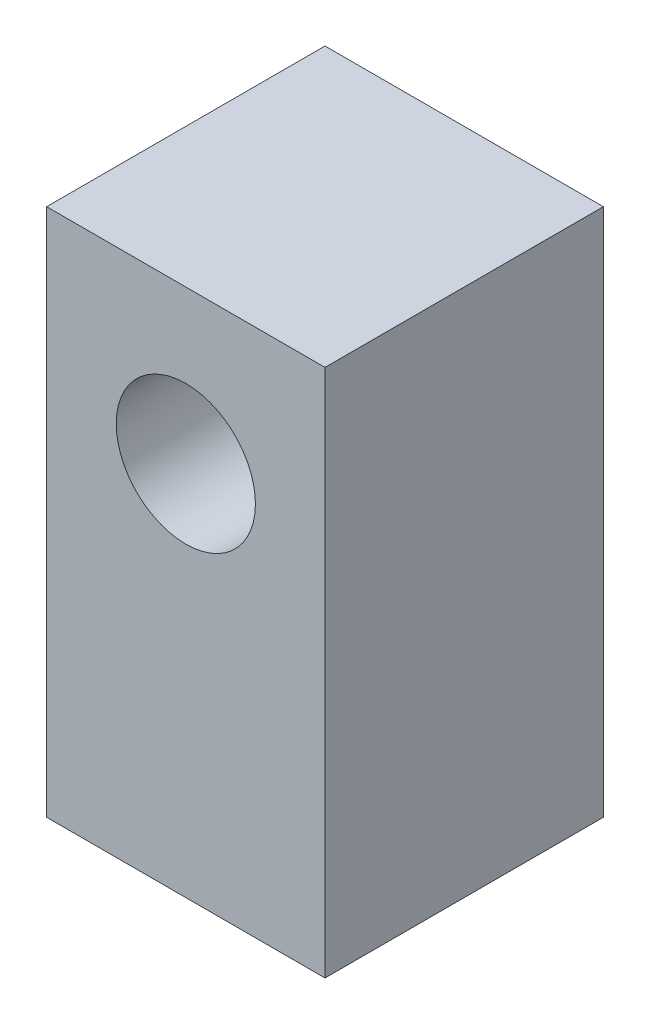
ISO-10303-21;
HEADER;
FILE_DESCRIPTION(('STEP AP214'),'2;1');
FILE_NAME('part.step','',(''),(''),'','','');
FILE_SCHEMA(('AUTOMOTIVE_DESIGN { 1 0 10303 214 1 1 1 1 }'));
ENDSEC;
DATA;
#1=APPLICATION_CONTEXT('core data for automotive mechanical design processes');
#2=APPLICATION_PROTOCOL_DEFINITION('international standard','automotive_design',2000,#1);
#3=PRODUCT_CONTEXT('',#1,'mechanical');
#4=PRODUCT('Part','Part','',(#3));
#5=PRODUCT_RELATED_PRODUCT_CATEGORY('part','',(#4));
#6=PRODUCT_DEFINITION_FORMATION('','',#4);
#7=PRODUCT_DEFINITION_CONTEXT('part definition',#1,'design');
#8=PRODUCT_DEFINITION('design','',#6,#7);
#9=PRODUCT_DEFINITION_SHAPE('','',#8);
#10=(LENGTH_UNIT() NAMED_UNIT(*) SI_UNIT(.MILLI.,.METRE.));
#11=(NAMED_UNIT(*) PLANE_ANGLE_UNIT() SI_UNIT($,.RADIAN.));
#12=(NAMED_UNIT(*) SI_UNIT($,.STERADIAN.) SOLID_ANGLE_UNIT());
#13=UNCERTAINTY_MEASURE_WITH_UNIT(LENGTH_MEASURE(1.E-05),#10,'distance_accuracy_value','');
#14=(GEOMETRIC_REPRESENTATION_CONTEXT(3) GLOBAL_UNCERTAINTY_ASSIGNED_CONTEXT((#13)) GLOBAL_UNIT_ASSIGNED_CONTEXT((#10,
#11,#12)) REPRESENTATION_CONTEXT('',''));
#15=CARTESIAN_POINT('',(0.,0.,0.));
#16=DIRECTION('',(0.,0.,1.));
#17=DIRECTION('',(1.,0.,0.));
#18=AXIS2_PLACEMENT_3D('',#15,#16,#17);
#19=CARTESIAN_POINT('',(0.,0.,10.));
#20=DIRECTION('',(1.,0.,0.));
#21=DIRECTION('',(0.,0.,-1.));
#22=AXIS2_PLACEMENT_3D('',#19,#20,#21);
#23=PLANE('',#22);
#24=DIRECTION('',(0.,-1.,0.));
#25=VECTOR('',#24,1.);
#26=CARTESIAN_POINT('',(0.,0.,0.));
#27=LINE('',#26,#25);
#28=CARTESIAN_POINT('',(0.,19.,0.));
#29=VERTEX_POINT('',#28);
#30=CARTESIAN_POINT('',(0.,0.,0.));
#31=VERTEX_POINT('',#30);
#32=EDGE_CURVE('E98',#29,#31,#27,.T.);
#33=ORIENTED_EDGE('',*,*,#32,.T.);
#34=DIRECTION('',(0.,0.,-1.));
#35=VECTOR('',#34,1.);
#36=CARTESIAN_POINT('',(0.,0.,10.));
#37=LINE('',#36,#35);
#38=CARTESIAN_POINT('',(0.,0.,10.));
#39=VERTEX_POINT('',#38);
#40=EDGE_CURVE('E11',#39,#31,#37,.T.);
#41=ORIENTED_EDGE('',*,*,#40,.F.);
#42=DIRECTION('',(0.,-1.,0.));
#43=VECTOR('',#42,1.);
#44=CARTESIAN_POINT('',(0.,0.,10.));
#45=LINE('',#44,#43);
#46=CARTESIAN_POINT('',(0.,19.,10.));
#47=VERTEX_POINT('',#46);
#48=EDGE_CURVE('E86',#47,#39,#45,.T.);
#49=ORIENTED_EDGE('',*,*,#48,.F.);
#50=DIRECTION('',(0.,0.,-1.));
#51=VECTOR('',#50,1.);
#52=CARTESIAN_POINT('',(0.,19.,10.));
#53=LINE('',#52,#51);
#54=EDGE_CURVE('E94',#47,#29,#53,.T.);
#55=ORIENTED_EDGE('',*,*,#54,.T.);
#56=EDGE_LOOP('',(#33,#41,#49,#55));
#57=FACE_BOUND('',#56,.T.);
#58=ADVANCED_FACE('F35',(#57),#23,.F.);
#59=CARTESIAN_POINT('',(0.,0.,10.));
#60=DIRECTION('',(0.,1.,0.));
#61=DIRECTION('',(0.,0.,1.));
#62=AXIS2_PLACEMENT_3D('',#59,#60,#61);
#63=PLANE('',#62);
#64=DIRECTION('',(1.,0.,0.));
#65=VECTOR('',#64,1.);
#66=CARTESIAN_POINT('',(0.,0.,0.));
#67=LINE('',#66,#65);
#68=CARTESIAN_POINT('',(10.,0.,0.));
#69=VERTEX_POINT('',#68);
#70=EDGE_CURVE('E90',#31,#69,#67,.T.);
#71=ORIENTED_EDGE('',*,*,#70,.T.);
#72=DIRECTION('',(0.,0.,-1.));
#73=VECTOR('',#72,1.);
#74=CARTESIAN_POINT('',(10.,0.,10.));
#75=LINE('',#74,#73);
#76=CARTESIAN_POINT('',(10.,0.,10.));
#77=VERTEX_POINT('',#76);
#78=EDGE_CURVE('E43',#77,#69,#75,.T.);
#79=ORIENTED_EDGE('',*,*,#78,.F.);
#80=DIRECTION('',(1.,0.,0.));
#81=VECTOR('',#80,1.);
#82=CARTESIAN_POINT('',(0.,0.,10.));
#83=LINE('',#82,#81);
#84=EDGE_CURVE('E81',#39,#77,#83,.T.);
#85=ORIENTED_EDGE('',*,*,#84,.F.);
#86=ORIENTED_EDGE('',*,*,#40,.T.);
#87=EDGE_LOOP('',(#71,#79,#85,#86));
#88=FACE_BOUND('',#87,.T.);
#89=ADVANCED_FACE('F89',(#88),#63,.F.);
#90=CARTESIAN_POINT('',(10.,0.,10.));
#91=DIRECTION('',(-1.,0.,0.));
#92=DIRECTION('',(0.,0.,1.));
#93=AXIS2_PLACEMENT_3D('',#90,#91,#92);
#94=PLANE('',#93);
#95=DIRECTION('',(0.,1.,0.));
#96=VECTOR('',#95,1.);
#97=CARTESIAN_POINT('',(10.,0.,0.));
#98=LINE('',#97,#96);
#99=CARTESIAN_POINT('',(10.,19.,0.));
#100=VERTEX_POINT('',#99);
#101=EDGE_CURVE('E68',#69,#100,#98,.T.);
#102=ORIENTED_EDGE('',*,*,#101,.T.);
#103=DIRECTION('',(0.,0.,-1.));
#104=VECTOR('',#103,1.);
#105=CARTESIAN_POINT('',(10.,19.,10.));
#106=LINE('',#105,#104);
#107=CARTESIAN_POINT('',(10.,19.,10.));
#108=VERTEX_POINT('',#107);
#109=EDGE_CURVE('E91',#108,#100,#106,.T.);
#110=ORIENTED_EDGE('',*,*,#109,.F.);
#111=DIRECTION('',(0.,1.,0.));
#112=VECTOR('',#111,1.);
#113=CARTESIAN_POINT('',(10.,0.,10.));
#114=LINE('',#113,#112);
#115=EDGE_CURVE('E84',#77,#108,#114,.T.);
#116=ORIENTED_EDGE('',*,*,#115,.F.);
#117=ORIENTED_EDGE('',*,*,#78,.T.);
#118=EDGE_LOOP('',(#102,#110,#116,#117));
#119=FACE_BOUND('',#118,.T.);
#120=ADVANCED_FACE('F92',(#119),#94,.F.);
#121=CARTESIAN_POINT('',(0.,19.,10.));
#122=DIRECTION('',(0.,-1.,0.));
#123=DIRECTION('',(0.,0.,-1.));
#124=AXIS2_PLACEMENT_3D('',#121,#122,#123);
#125=PLANE('',#124);
#126=DIRECTION('',(-1.,0.,0.));
#127=VECTOR('',#126,1.);
#128=CARTESIAN_POINT('',(0.,19.,0.));
#129=LINE('',#128,#127);
#130=EDGE_CURVE('E74',#100,#29,#129,.T.);
#131=ORIENTED_EDGE('',*,*,#130,.T.);
#132=ORIENTED_EDGE('',*,*,#54,.F.);
#133=DIRECTION('',(-1.,0.,0.));
#134=VECTOR('',#133,1.);
#135=CARTESIAN_POINT('',(0.,19.,10.));
#136=LINE('',#135,#134);
#137=EDGE_CURVE('E51',#108,#47,#136,.T.);
#138=ORIENTED_EDGE('',*,*,#137,.F.);
#139=ORIENTED_EDGE('',*,*,#109,.T.);
#140=EDGE_LOOP('',(#131,#132,#138,#139));
#141=FACE_BOUND('',#140,.T.);
#142=ADVANCED_FACE('F106',(#141),#125,.F.);
#143=CARTESIAN_POINT('',(0.,0.,10.));
#144=DIRECTION('',(0.,0.,-1.));
#145=DIRECTION('',(-1.,0.,0.));
#146=AXIS2_PLACEMENT_3D('',#143,#144,#145);
#147=PLANE('',#146);
#148=CARTESIAN_POINT('',(5.,13.5,10.));
#149=DIRECTION('',(0.,0.,-1.));
#150=DIRECTION('',(-1.,0.,0.));
#151=AXIS2_PLACEMENT_3D('',#148,#149,#150);
#152=CIRCLE('',#151,2.5);
#153=CARTESIAN_POINT('',(2.5,13.5,10.));
#154=VERTEX_POINT('',#153);
#155=EDGE_CURVE('E101',#154,#154,#152,.T.);
#156=ORIENTED_EDGE('',*,*,#155,.T.);
#157=EDGE_LOOP('',(#156));
#158=FACE_BOUND('',#157,.T.);
#159=ORIENTED_EDGE('',*,*,#48,.T.);
#160=ORIENTED_EDGE('',*,*,#84,.T.);
#161=ORIENTED_EDGE('',*,*,#115,.T.);
#162=ORIENTED_EDGE('',*,*,#137,.T.);
#163=EDGE_LOOP('',(#159,#160,#161,#162));
#164=FACE_BOUND('',#163,.T.);
#165=ADVANCED_FACE('F82',(#158,#164),#147,.F.);
#166=CARTESIAN_POINT('',(0.,0.,0.));
#167=DIRECTION('',(0.,0.,-1.));
#168=DIRECTION('',(-1.,0.,0.));
#169=AXIS2_PLACEMENT_3D('',#166,#167,#168);
#170=PLANE('',#169);
#171=CARTESIAN_POINT('',(5.,13.5,0.));
#172=DIRECTION('',(0.,0.,-1.));
#173=DIRECTION('',(-1.,0.,0.));
#174=AXIS2_PLACEMENT_3D('',#171,#172,#173);
#175=CIRCLE('',#174,2.5);
#176=CARTESIAN_POINT('',(2.5,13.5,0.));
#177=VERTEX_POINT('',#176);
#178=EDGE_CURVE('E112',#177,#177,#175,.T.);
#179=ORIENTED_EDGE('',*,*,#178,.F.);
#180=EDGE_LOOP('',(#179));
#181=FACE_BOUND('',#180,.T.);
#182=ORIENTED_EDGE('',*,*,#32,.F.);
#183=ORIENTED_EDGE('',*,*,#130,.F.);
#184=ORIENTED_EDGE('',*,*,#101,.F.);
#185=ORIENTED_EDGE('',*,*,#70,.F.);
#186=EDGE_LOOP('',(#182,#183,#184,#185));
#187=FACE_BOUND('',#186,.T.);
#188=ADVANCED_FACE('F109',(#181,#187),#170,.T.);
#189=CARTESIAN_POINT('',(5.,13.5,10.));
#190=DIRECTION('',(0.,0.,-1.));
#191=DIRECTION('',(-1.,0.,0.));
#192=AXIS2_PLACEMENT_3D('',#189,#190,#191);
#193=CYLINDRICAL_SURFACE('',#192,2.5);
#194=ORIENTED_EDGE('',*,*,#155,.F.);
#195=EDGE_LOOP('',(#194));
#196=FACE_BOUND('',#195,.T.);
#197=ORIENTED_EDGE('',*,*,#178,.T.);
#198=EDGE_LOOP('',(#197));
#199=FACE_BOUND('',#198,.T.);
#200=ADVANCED_FACE('F119',(#196,#199),#193,.F.);
#201=CLOSED_SHELL('',(#58,#89,#120,#142,#165,#188,#200));
#202=MANIFOLD_SOLID_BREP('B2',#201);
#203=ADVANCED_BREP_SHAPE_REPRESENTATION('',(#18,#202),#14);
#204=SHAPE_DEFINITION_REPRESENTATION(#9,#203);
ENDSEC;
END-ISO-10303-21;
